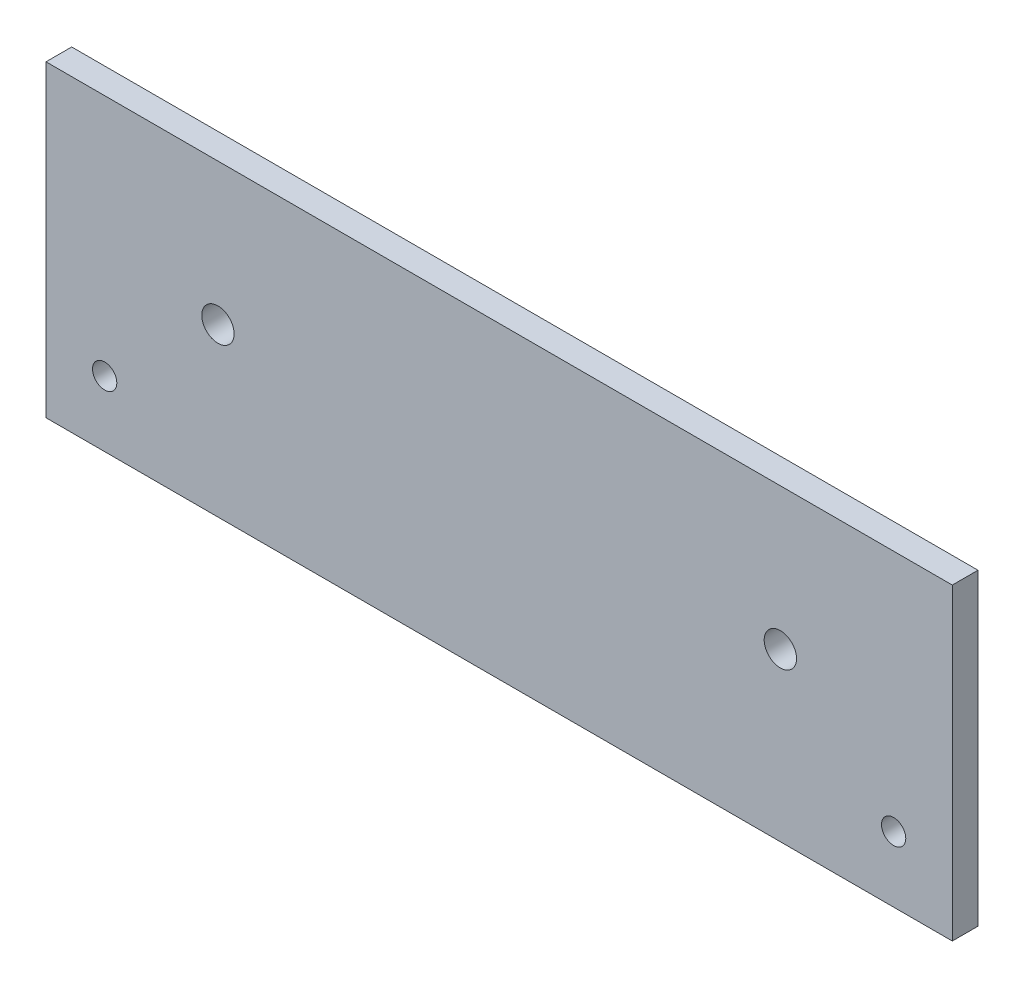
ISO-10303-21;
HEADER;
FILE_DESCRIPTION(('STEP AP214'),'2;1');
FILE_NAME('part.step','',(''),(''),'','','');
FILE_SCHEMA(('AUTOMOTIVE_DESIGN { 1 0 10303 214 1 1 1 1 }'));
ENDSEC;
DATA;
#1=APPLICATION_CONTEXT('core data for automotive mechanical design processes');
#2=APPLICATION_PROTOCOL_DEFINITION('international standard','automotive_design',2000,#1);
#3=PRODUCT_CONTEXT('',#1,'mechanical');
#4=PRODUCT('Part','Part','',(#3));
#5=PRODUCT_RELATED_PRODUCT_CATEGORY('part','',(#4));
#6=PRODUCT_DEFINITION_FORMATION('','',#4);
#7=PRODUCT_DEFINITION_CONTEXT('part definition',#1,'design');
#8=PRODUCT_DEFINITION('design','',#6,#7);
#9=PRODUCT_DEFINITION_SHAPE('','',#8);
#10=(LENGTH_UNIT() NAMED_UNIT(*) SI_UNIT(.MILLI.,.METRE.));
#11=(NAMED_UNIT(*) PLANE_ANGLE_UNIT() SI_UNIT($,.RADIAN.));
#12=(NAMED_UNIT(*) SI_UNIT($,.STERADIAN.) SOLID_ANGLE_UNIT());
#13=UNCERTAINTY_MEASURE_WITH_UNIT(LENGTH_MEASURE(1.E-05),#10,'distance_accuracy_value','');
#14=(GEOMETRIC_REPRESENTATION_CONTEXT(3) GLOBAL_UNCERTAINTY_ASSIGNED_CONTEXT((#13)) GLOBAL_UNIT_ASSIGNED_CONTEXT((#10,
#11,#12)) REPRESENTATION_CONTEXT('',''));
#15=CARTESIAN_POINT('',(0.,0.,0.));
#16=DIRECTION('',(0.,0.,1.));
#17=DIRECTION('',(1.,0.,0.));
#18=AXIS2_PLACEMENT_3D('',#15,#16,#17);
#19=CARTESIAN_POINT('',(0.,0.,6.35));
#20=DIRECTION('',(0.,0.,-1.));
#21=DIRECTION('',(-1.,0.,0.));
#22=AXIS2_PLACEMENT_3D('',#19,#20,#21);
#23=PLANE('',#22);
#24=CARTESIAN_POINT('',(14.5,16.2,6.35));
#25=DIRECTION('',(0.,0.,1.));
#26=DIRECTION('',(1.,0.,0.));
#27=AXIS2_PLACEMENT_3D('',#24,#25,#26);
#28=CIRCLE('',#27,3.00000000000001);
#29=CARTESIAN_POINT('',(17.5,16.2,6.35));
#30=VERTEX_POINT('',#29);
#31=EDGE_CURVE('E120',#30,#30,#28,.T.);
#32=ORIENTED_EDGE('',*,*,#31,.F.);
#33=EDGE_LOOP('',(#32));
#34=FACE_BOUND('',#33,.T.);
#35=CARTESIAN_POINT('',(42.5,41.2,6.35));
#36=DIRECTION('',(0.,0.,1.));
#37=DIRECTION('',(1.,0.,0.));
#38=AXIS2_PLACEMENT_3D('',#35,#36,#37);
#39=CIRCLE('',#38,3.99999999999999);
#40=CARTESIAN_POINT('',(46.5,41.2,6.35));
#41=VERTEX_POINT('',#40);
#42=EDGE_CURVE('E99',#41,#41,#39,.T.);
#43=ORIENTED_EDGE('',*,*,#42,.F.);
#44=EDGE_LOOP('',(#43));
#45=FACE_BOUND('',#44,.T.);
#46=DIRECTION('',(0.,-1.,0.));
#47=VECTOR('',#46,1.);
#48=CARTESIAN_POINT('',(0.,0.,6.35));
#49=LINE('',#48,#47);
#50=CARTESIAN_POINT('',(0.,76.2,6.35));
#51=VERTEX_POINT('',#50);
#52=CARTESIAN_POINT('',(0.,0.,6.35));
#53=VERTEX_POINT('',#52);
#54=EDGE_CURVE('E84',#51,#53,#49,.T.);
#55=ORIENTED_EDGE('',*,*,#54,.T.);
#56=DIRECTION('',(1.,0.,0.));
#57=VECTOR('',#56,1.);
#58=CARTESIAN_POINT('',(0.,0.,6.35));
#59=LINE('',#58,#57);
#60=CARTESIAN_POINT('',(224.,0.,6.35));
#61=VERTEX_POINT('',#60);
#62=EDGE_CURVE('E79',#53,#61,#59,.T.);
#63=ORIENTED_EDGE('',*,*,#62,.T.);
#64=DIRECTION('',(0.,1.,0.));
#65=VECTOR('',#64,1.);
#66=CARTESIAN_POINT('',(224.,0.,6.35));
#67=LINE('',#66,#65);
#68=CARTESIAN_POINT('',(224.,76.2,6.35));
#69=VERTEX_POINT('',#68);
#70=EDGE_CURVE('E82',#61,#69,#67,.T.);
#71=ORIENTED_EDGE('',*,*,#70,.T.);
#72=DIRECTION('',(-1.,0.,0.));
#73=VECTOR('',#72,1.);
#74=CARTESIAN_POINT('',(0.,76.2,6.35));
#75=LINE('',#74,#73);
#76=EDGE_CURVE('E49',#69,#51,#75,.T.);
#77=ORIENTED_EDGE('',*,*,#76,.T.);
#78=EDGE_LOOP('',(#55,#63,#71,#77));
#79=FACE_BOUND('',#78,.T.);
#80=CARTESIAN_POINT('',(181.5,41.2,6.35));
#81=DIRECTION('',(0.,0.,1.));
#82=DIRECTION('',(1.,0.,0.));
#83=AXIS2_PLACEMENT_3D('',#80,#81,#82);
#84=CIRCLE('',#83,4.00000000000002);
#85=CARTESIAN_POINT('',(185.5,41.2,6.35));
#86=VERTEX_POINT('',#85);
#87=EDGE_CURVE('E114',#86,#86,#84,.T.);
#88=ORIENTED_EDGE('',*,*,#87,.F.);
#89=EDGE_LOOP('',(#88));
#90=FACE_BOUND('',#89,.T.);
#91=CARTESIAN_POINT('',(209.5,16.2,6.35));
#92=DIRECTION('',(0.,0.,1.));
#93=DIRECTION('',(1.,0.,0.));
#94=AXIS2_PLACEMENT_3D('',#91,#92,#93);
#95=CIRCLE('',#94,2.99999999999999);
#96=CARTESIAN_POINT('',(212.5,16.2,6.35));
#97=VERTEX_POINT('',#96);
#98=EDGE_CURVE('E126',#97,#97,#95,.T.);
#99=ORIENTED_EDGE('',*,*,#98,.F.);
#100=EDGE_LOOP('',(#99));
#101=FACE_BOUND('',#100,.T.);
#102=ADVANCED_FACE('F32',(#34,#45,#79,#90,#101),#23,.F.);
#103=CARTESIAN_POINT('',(0.,0.,0.));
#104=DIRECTION('',(0.,0.,-1.));
#105=DIRECTION('',(-1.,0.,0.));
#106=AXIS2_PLACEMENT_3D('',#103,#104,#105);
#107=PLANE('',#106);
#108=CARTESIAN_POINT('',(14.5,16.2,0.));
#109=DIRECTION('',(0.,0.,1.));
#110=DIRECTION('',(1.,0.,0.));
#111=AXIS2_PLACEMENT_3D('',#108,#109,#110);
#112=CIRCLE('',#111,3.00000000000001);
#113=CARTESIAN_POINT('',(17.5,16.2,0.));
#114=VERTEX_POINT('',#113);
#115=EDGE_CURVE('E123',#114,#114,#112,.T.);
#116=ORIENTED_EDGE('',*,*,#115,.T.);
#117=EDGE_LOOP('',(#116));
#118=FACE_BOUND('',#117,.T.);
#119=CARTESIAN_POINT('',(42.5,41.2,0.));
#120=DIRECTION('',(0.,0.,1.));
#121=DIRECTION('',(1.,0.,0.));
#122=AXIS2_PLACEMENT_3D('',#119,#120,#121);
#123=CIRCLE('',#122,3.99999999999999);
#124=CARTESIAN_POINT('',(46.5,41.2,0.));
#125=VERTEX_POINT('',#124);
#126=EDGE_CURVE('E111',#125,#125,#123,.T.);
#127=ORIENTED_EDGE('',*,*,#126,.T.);
#128=EDGE_LOOP('',(#127));
#129=FACE_BOUND('',#128,.T.);
#130=DIRECTION('',(0.,-1.,0.));
#131=VECTOR('',#130,1.);
#132=CARTESIAN_POINT('',(0.,0.,0.));
#133=LINE('',#132,#131);
#134=CARTESIAN_POINT('',(0.,76.2,0.));
#135=VERTEX_POINT('',#134);
#136=CARTESIAN_POINT('',(0.,0.,0.));
#137=VERTEX_POINT('',#136);
#138=EDGE_CURVE('E96',#135,#137,#133,.T.);
#139=ORIENTED_EDGE('',*,*,#138,.F.);
#140=DIRECTION('',(-1.,0.,0.));
#141=VECTOR('',#140,1.);
#142=CARTESIAN_POINT('',(0.,76.2,0.));
#143=LINE('',#142,#141);
#144=CARTESIAN_POINT('',(224.,76.2,0.));
#145=VERTEX_POINT('',#144);
#146=EDGE_CURVE('E72',#145,#135,#143,.T.);
#147=ORIENTED_EDGE('',*,*,#146,.F.);
#148=DIRECTION('',(0.,1.,0.));
#149=VECTOR('',#148,1.);
#150=CARTESIAN_POINT('',(224.,0.,0.));
#151=LINE('',#150,#149);
#152=CARTESIAN_POINT('',(224.,0.,0.));
#153=VERTEX_POINT('',#152);
#154=EDGE_CURVE('E66',#153,#145,#151,.T.);
#155=ORIENTED_EDGE('',*,*,#154,.F.);
#156=DIRECTION('',(1.,0.,0.));
#157=VECTOR('',#156,1.);
#158=CARTESIAN_POINT('',(0.,0.,0.));
#159=LINE('',#158,#157);
#160=EDGE_CURVE('E88',#137,#153,#159,.T.);
#161=ORIENTED_EDGE('',*,*,#160,.F.);
#162=EDGE_LOOP('',(#139,#147,#155,#161));
#163=FACE_BOUND('',#162,.T.);
#164=CARTESIAN_POINT('',(181.5,41.2,0.));
#165=DIRECTION('',(0.,0.,1.));
#166=DIRECTION('',(1.,0.,0.));
#167=AXIS2_PLACEMENT_3D('',#164,#165,#166);
#168=CIRCLE('',#167,4.00000000000002);
#169=CARTESIAN_POINT('',(185.5,41.2,0.));
#170=VERTEX_POINT('',#169);
#171=EDGE_CURVE('E117',#170,#170,#168,.T.);
#172=ORIENTED_EDGE('',*,*,#171,.T.);
#173=EDGE_LOOP('',(#172));
#174=FACE_BOUND('',#173,.T.);
#175=CARTESIAN_POINT('',(209.5,16.2,0.));
#176=DIRECTION('',(0.,0.,1.));
#177=DIRECTION('',(1.,0.,0.));
#178=AXIS2_PLACEMENT_3D('',#175,#176,#177);
#179=CIRCLE('',#178,2.99999999999999);
#180=CARTESIAN_POINT('',(212.5,16.2,0.));
#181=VERTEX_POINT('',#180);
#182=EDGE_CURVE('E129',#181,#181,#179,.T.);
#183=ORIENTED_EDGE('',*,*,#182,.T.);
#184=EDGE_LOOP('',(#183));
#185=FACE_BOUND('',#184,.T.);
#186=ADVANCED_FACE('F107',(#118,#129,#163,#174,#185),#107,.T.);
#187=CARTESIAN_POINT('',(0.,0.,6.35));
#188=DIRECTION('',(1.,0.,0.));
#189=DIRECTION('',(0.,0.,-1.));
#190=AXIS2_PLACEMENT_3D('',#187,#188,#189);
#191=PLANE('',#190);
#192=ORIENTED_EDGE('',*,*,#138,.T.);
#193=DIRECTION('',(0.,0.,-1.));
#194=VECTOR('',#193,1.);
#195=CARTESIAN_POINT('',(0.,0.,6.35));
#196=LINE('',#195,#194);
#197=EDGE_CURVE('E11',#53,#137,#196,.T.);
#198=ORIENTED_EDGE('',*,*,#197,.F.);
#199=ORIENTED_EDGE('',*,*,#54,.F.);
#200=DIRECTION('',(0.,0.,-1.));
#201=VECTOR('',#200,1.);
#202=CARTESIAN_POINT('',(0.,76.2,6.35));
#203=LINE('',#202,#201);
#204=EDGE_CURVE('E92',#51,#135,#203,.T.);
#205=ORIENTED_EDGE('',*,*,#204,.T.);
#206=EDGE_LOOP('',(#192,#198,#199,#205));
#207=FACE_BOUND('',#206,.T.);
#208=ADVANCED_FACE('F34',(#207),#191,.F.);
#209=CARTESIAN_POINT('',(0.,0.,6.35));
#210=DIRECTION('',(0.,1.,0.));
#211=DIRECTION('',(-1.,0.,0.));
#212=AXIS2_PLACEMENT_3D('',#209,#210,#211);
#213=PLANE('',#212);
#214=ORIENTED_EDGE('',*,*,#160,.T.);
#215=DIRECTION('',(0.,0.,-1.));
#216=VECTOR('',#215,1.);
#217=CARTESIAN_POINT('',(224.,0.,6.35));
#218=LINE('',#217,#216);
#219=EDGE_CURVE('E41',#61,#153,#218,.T.);
#220=ORIENTED_EDGE('',*,*,#219,.F.);
#221=ORIENTED_EDGE('',*,*,#62,.F.);
#222=ORIENTED_EDGE('',*,*,#197,.T.);
#223=EDGE_LOOP('',(#214,#220,#221,#222));
#224=FACE_BOUND('',#223,.T.);
#225=ADVANCED_FACE('F87',(#224),#213,.F.);
#226=CARTESIAN_POINT('',(224.,0.,6.35));
#227=DIRECTION('',(-1.,0.,0.));
#228=DIRECTION('',(0.,-1.,0.));
#229=AXIS2_PLACEMENT_3D('',#226,#227,#228);
#230=PLANE('',#229);
#231=ORIENTED_EDGE('',*,*,#154,.T.);
#232=DIRECTION('',(0.,0.,-1.));
#233=VECTOR('',#232,1.);
#234=CARTESIAN_POINT('',(224.,76.2,6.35));
#235=LINE('',#234,#233);
#236=EDGE_CURVE('E89',#69,#145,#235,.T.);
#237=ORIENTED_EDGE('',*,*,#236,.F.);
#238=ORIENTED_EDGE('',*,*,#70,.F.);
#239=ORIENTED_EDGE('',*,*,#219,.T.);
#240=EDGE_LOOP('',(#231,#237,#238,#239));
#241=FACE_BOUND('',#240,.T.);
#242=ADVANCED_FACE('F90',(#241),#230,.F.);
#243=CARTESIAN_POINT('',(0.,76.2,6.35));
#244=DIRECTION('',(0.,-1.,0.));
#245=DIRECTION('',(1.,0.,0.));
#246=AXIS2_PLACEMENT_3D('',#243,#244,#245);
#247=PLANE('',#246);
#248=ORIENTED_EDGE('',*,*,#146,.T.);
#249=ORIENTED_EDGE('',*,*,#204,.F.);
#250=ORIENTED_EDGE('',*,*,#76,.F.);
#251=ORIENTED_EDGE('',*,*,#236,.T.);
#252=EDGE_LOOP('',(#248,#249,#250,#251));
#253=FACE_BOUND('',#252,.T.);
#254=ADVANCED_FACE('F104',(#253),#247,.F.);
#255=CARTESIAN_POINT('',(42.5,41.2,6.35));
#256=DIRECTION('',(0.,0.,-1.));
#257=DIRECTION('',(-1.,0.,0.));
#258=AXIS2_PLACEMENT_3D('',#255,#256,#257);
#259=CYLINDRICAL_SURFACE('',#258,3.99999999999999);
#260=ORIENTED_EDGE('',*,*,#42,.T.);
#261=EDGE_LOOP('',(#260));
#262=FACE_BOUND('',#261,.T.);
#263=ORIENTED_EDGE('',*,*,#126,.F.);
#264=EDGE_LOOP('',(#263));
#265=FACE_BOUND('',#264,.T.);
#266=ADVANCED_FACE('F149',(#262,#265),#259,.F.);
#267=CARTESIAN_POINT('',(181.5,41.2,6.35));
#268=DIRECTION('',(0.,0.,-1.));
#269=DIRECTION('',(-1.,0.,0.));
#270=AXIS2_PLACEMENT_3D('',#267,#268,#269);
#271=CYLINDRICAL_SURFACE('',#270,4.00000000000002);
#272=ORIENTED_EDGE('',*,*,#87,.T.);
#273=EDGE_LOOP('',(#272));
#274=FACE_BOUND('',#273,.T.);
#275=ORIENTED_EDGE('',*,*,#171,.F.);
#276=EDGE_LOOP('',(#275));
#277=FACE_BOUND('',#276,.T.);
#278=ADVANCED_FACE('F195',(#274,#277),#271,.F.);
#279=CARTESIAN_POINT('',(14.5,16.2,6.35));
#280=DIRECTION('',(0.,0.,-1.));
#281=DIRECTION('',(-1.,0.,0.));
#282=AXIS2_PLACEMENT_3D('',#279,#280,#281);
#283=CYLINDRICAL_SURFACE('',#282,3.00000000000001);
#284=ORIENTED_EDGE('',*,*,#31,.T.);
#285=EDGE_LOOP('',(#284));
#286=FACE_BOUND('',#285,.T.);
#287=ORIENTED_EDGE('',*,*,#115,.F.);
#288=EDGE_LOOP('',(#287));
#289=FACE_BOUND('',#288,.T.);
#290=ADVANCED_FACE('F203',(#286,#289),#283,.F.);
#291=CARTESIAN_POINT('',(209.5,16.2,6.35));
#292=DIRECTION('',(0.,0.,-1.));
#293=DIRECTION('',(-1.,0.,0.));
#294=AXIS2_PLACEMENT_3D('',#291,#292,#293);
#295=CYLINDRICAL_SURFACE('',#294,2.99999999999999);
#296=ORIENTED_EDGE('',*,*,#98,.T.);
#297=EDGE_LOOP('',(#296));
#298=FACE_BOUND('',#297,.T.);
#299=ORIENTED_EDGE('',*,*,#182,.F.);
#300=EDGE_LOOP('',(#299));
#301=FACE_BOUND('',#300,.T.);
#302=ADVANCED_FACE('F135',(#298,#301),#295,.F.);
#303=CLOSED_SHELL('',(#102,#186,#208,#225,#242,#254,#266,#278,#290,#302));
#304=MANIFOLD_SOLID_BREP('B2',#303);
#305=ADVANCED_BREP_SHAPE_REPRESENTATION('',(#18,#304),#14);
#306=SHAPE_DEFINITION_REPRESENTATION(#9,#305);
ENDSEC;
END-ISO-10303-21;
